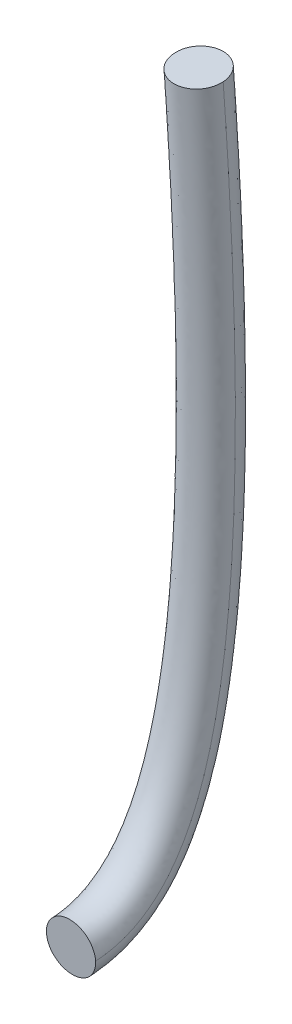
ISO-10303-21;
HEADER;
FILE_DESCRIPTION(('STEP AP214'),'2;1');
FILE_NAME('part.step','',(''),(''),'','','');
FILE_SCHEMA(('AUTOMOTIVE_DESIGN { 1 0 10303 214 1 1 1 1 }'));
ENDSEC;
DATA;
#1=APPLICATION_CONTEXT('core data for automotive mechanical design processes');
#2=APPLICATION_PROTOCOL_DEFINITION('international standard','automotive_design',2000,#1);
#3=PRODUCT_CONTEXT('',#1,'mechanical');
#4=PRODUCT('Part','Part','',(#3));
#5=PRODUCT_RELATED_PRODUCT_CATEGORY('part','',(#4));
#6=PRODUCT_DEFINITION_FORMATION('','',#4);
#7=PRODUCT_DEFINITION_CONTEXT('part definition',#1,'design');
#8=PRODUCT_DEFINITION('design','',#6,#7);
#9=PRODUCT_DEFINITION_SHAPE('','',#8);
#10=(LENGTH_UNIT() NAMED_UNIT(*) SI_UNIT(.MILLI.,.METRE.));
#11=(NAMED_UNIT(*) PLANE_ANGLE_UNIT() SI_UNIT($,.RADIAN.));
#12=(NAMED_UNIT(*) SI_UNIT($,.STERADIAN.) SOLID_ANGLE_UNIT());
#13=UNCERTAINTY_MEASURE_WITH_UNIT(LENGTH_MEASURE(1.E-05),#10,'distance_accuracy_value','');
#14=(GEOMETRIC_REPRESENTATION_CONTEXT(3) GLOBAL_UNCERTAINTY_ASSIGNED_CONTEXT((#13)) GLOBAL_UNIT_ASSIGNED_CONTEXT((#10,
#11,#12)) REPRESENTATION_CONTEXT('',''));
#15=CARTESIAN_POINT('',(0.,0.,0.));
#16=DIRECTION('',(0.,0.,1.));
#17=DIRECTION('',(1.,0.,0.));
#18=AXIS2_PLACEMENT_3D('',#15,#16,#17);
#19=CARTESIAN_POINT('',(25.625,-7.38568943191456,11.1672900449514));
#20=CARTESIAN_POINT('',(25.6249999999998,-7.37642950308164,10.9994364502612));
#21=CARTESIAN_POINT('',(25.6249999999996,-7.27631127881116,10.6948021147548));
#22=CARTESIAN_POINT('',(25.6249999999997,-6.87049792354858,10.3351974211068));
#23=CARTESIAN_POINT('',(25.6250000000001,-6.18722766399162,10.0812489826231));
#24=CARTESIAN_POINT('',(25.6250000000006,-5.06639524678638,9.90823536518859));
#25=CARTESIAN_POINT('',(25.6250000000009,-3.38100140559299,9.86451819427135));
#26=CARTESIAN_POINT('',(25.6250000000004,-1.83527381521949,9.93899557759439));
#27=CARTESIAN_POINT('',(25.625,-1.00000001490137,10.0000001490162));
#28=CARTESIAN_POINT('',(25.625000000001,-7.43610265920569,11.1645089135862));
#29=CARTESIAN_POINT('',(25.6250000000008,-7.42638032085317,10.9882732782254));
#30=CARTESIAN_POINT('',(25.6250000000007,-7.31962391119563,10.663863154122));
#31=CARTESIAN_POINT('',(25.6250000000008,-6.89389460357569,10.2891900921489));
#32=CARTESIAN_POINT('',(25.6250000000012,-6.19822115272071,10.0317030959541));
#33=CARTESIAN_POINT('',(25.6250000000017,-5.06946988828723,9.85763202290294));
#34=CARTESIAN_POINT('',(25.6250000000019,-3.37990497108782,9.81401688870553));
#35=CARTESIAN_POINT('',(25.6250000000015,-1.83238214013707,9.88858240859414));
#36=CARTESIAN_POINT('',(25.625000000001,-0.996322261093759,9.94964439160444));
#37=CARTESIAN_POINT('',(25.6014558196561,-7.50309691686465,11.1608130614999));
#38=CARTESIAN_POINT('',(25.6014558196559,-7.49276045520994,10.9734452883316));
#39=CARTESIAN_POINT('',(25.6014558196557,-7.37717732256412,10.6227575169738));
#40=CARTESIAN_POINT('',(25.6014558196558,-6.92499161090427,10.2280673151373));
#41=CARTESIAN_POINT('',(25.6014558196562,-6.21283702915476,9.96587232267118));
#42=CARTESIAN_POINT('',(25.6014558196567,-5.07356146919937,9.79039233227121));
#43=CARTESIAN_POINT('',(25.601455819657,-3.37845320031232,9.7469097299548));
#44=CARTESIAN_POINT('',(25.6014558196565,-1.82853875078202,9.82158827480915));
#45=CARTESIAN_POINT('',(25.6014558196561,-0.99143488531101,9.88272650580492));
#46=CARTESIAN_POINT('',(25.5294787377127,-7.574708431295,11.1568624905964));
#47=CARTESIAN_POINT('',(25.5294787377125,-7.56371622354454,10.9576080883444));
#48=CARTESIAN_POINT('',(25.5294787377123,-7.43868821079338,10.5788362060441));
#49=CARTESIAN_POINT('',(25.5294787377124,-6.95824142372153,10.1627629093637));
#50=CARTESIAN_POINT('',(25.5294787377128,-6.22847264731504,9.8955249203416));
#51=CARTESIAN_POINT('',(25.5294787377133,-5.07794572483307,9.71853202565486));
#52=CARTESIAN_POINT('',(25.5294787377136,-3.37691130562669,9.67518532771332));
#53=CARTESIAN_POINT('',(25.5294787377131,-1.8244292797513,9.74997698003554));
#54=CARTESIAN_POINT('',(25.5294787377127,-0.986210670674989,9.81119662679685));
#55=CARTESIAN_POINT('',(25.4361632911616,-7.61993766165806,11.1543673432325));
#56=CARTESIAN_POINT('',(25.4361632911614,-7.60853037733703,10.9475888988735));
#57=CARTESIAN_POINT('',(25.4361632911612,-7.47754981155898,10.5510733568784));
#58=CARTESIAN_POINT('',(25.4361632911613,-6.97922926280271,10.1214769710157));
#59=CARTESIAN_POINT('',(25.4361632911617,-6.23833184728273,9.85106753949907));
#60=CARTESIAN_POINT('',(25.4361632911622,-5.0807009069797,9.67312805005117));
#61=CARTESIAN_POINT('',(25.4361632911625,-3.3759245550945,9.62987467288582));
#62=CARTESIAN_POINT('',(25.436163291162,-1.82183532421436,9.70474777506866));
#63=CARTESIAN_POINT('',(25.4361632911616,-0.982911100639132,9.76601895668007));
#64=CARTESIAN_POINT('',(25.2949455160897,-7.60399867079656,11.1552466447533));
#65=CARTESIAN_POINT('',(25.2949455160895,-7.59273786953006,10.9511234807646));
#66=CARTESIAN_POINT('',(25.2949455160894,-7.46385210302982,10.5608622484204));
#67=CARTESIAN_POINT('',(25.2949455160895,-6.97183589259492,10.1360354992856));
#68=CARTESIAN_POINT('',(25.2949455160899,-6.23486109615012,9.86674058148387));
#69=CARTESIAN_POINT('',(25.2949455160904,-5.0797331321152,9.68913263732427));
#70=CARTESIAN_POINT('',(25.2949455160906,-3.37627523259321,9.64584466686064));
#71=CARTESIAN_POINT('',(25.2949455160902,-1.82274909235873,9.72068678282293));
#72=CARTESIAN_POINT('',(25.2949455160897,-0.984073884445762,9.78193977747127));
#73=CARTESIAN_POINT('',(25.1680955457305,-7.47839466474527,11.1621758032222));
#74=CARTESIAN_POINT('',(25.1680955457303,-7.46828503153356,10.9789197214295));
#75=CARTESIAN_POINT('',(25.1680955457301,-7.35595108834263,10.6379236311398));
#76=CARTESIAN_POINT('',(25.1680955457302,-6.91353075570379,10.2506217081272));
#77=CARTESIAN_POINT('',(25.1680955457306,-6.20745468367914,9.99015685038805));
#78=CARTESIAN_POINT('',(25.1680955457311,-5.07205870745476,9.81519256043686));
#79=CARTESIAN_POINT('',(25.1680955457314,-3.37899398021394,9.7716579117466));
#80=CARTESIAN_POINT('',(25.1680955457309,-1.82995523363427,9.84629052939088));
#81=CARTESIAN_POINT('',(25.1680955457305,-0.99323696795245,9.90740059794474));
#82=CARTESIAN_POINT('',(25.1680052570041,-7.34853018912359,11.1693399977358));
#83=CARTESIAN_POINT('',(25.1680052570039,-7.33961103062633,11.0076635051404));
#84=CARTESIAN_POINT('',(25.1680052570037,-7.24438672468251,10.7176053189323));
#85=CARTESIAN_POINT('',(25.1680052570038,-6.85325145601574,10.3691060864338));
#86=CARTESIAN_POINT('',(25.1680052570042,-6.17912322844163,10.1177669209717));
#87=CARTESIAN_POINT('',(25.1680052570047,-5.06412790780888,9.94553341823572));
#88=CARTESIAN_POINT('',(25.168005257005,-3.38180861115756,9.90174159871763));
#89=CARTESIAN_POINT('',(25.1680052570045,-1.83740536552874,9.97615476891002));
#90=CARTESIAN_POINT('',(25.1680052570041,-1.00271086191551,10.0371170311547));
#91=CARTESIAN_POINT('',(25.1971056395939,-7.2881659609287,11.1726700929784));
#92=CARTESIAN_POINT('',(25.1971056395937,-7.27979999106427,11.0210211829097));
#93=CARTESIAN_POINT('',(25.1971056395936,-7.19253109322445,10.7546390623493));
#94=CARTESIAN_POINT('',(25.1971056395937,-6.82522977370396,10.4241729165544));
#95=CARTESIAN_POINT('',(25.197105639594,-6.16595100024323,10.1770781981071));
#96=CARTESIAN_POINT('',(25.1971056395946,-5.06043883752271,10.0061157330043));
#97=CARTESIAN_POINT('',(25.1971056395948,-3.38311446859936,9.96220579694382));
#98=CARTESIAN_POINT('',(25.1971056395944,-1.84086866655294,10.0365188658134));
#99=CARTESIAN_POINT('',(25.1971056395939,-1.00711456273007,10.0974124455659));
#100=B_SPLINE_SURFACE_WITH_KNOTS('',3,3,((#19,#20,#21,#22,#23,#24,#25,#26,#27),(#28,#29,#30,#31,
#32,#33,#34,#35,#36),(#37,#38,#39,#40,#41,#42,#43,#44,#45),(#46,#47,#48,#49,#50,#51,#52,#53,
#54),(#55,#56,#57,#58,#59,#60,#61,#62,#63),(#64,#65,#66,#67,#68,#69,#70,#71,#72),(#73,#74,#75,
#76,#77,#78,#79,#80,#81),(#82,#83,#84,#85,#86,#87,#88,#89,#90),(#91,#92,#93,#94,#95,#96,#97,#98,
#99)),.UNSPECIFIED.,.F.,.F.,.F.,(4,1,1,1,1,1,4),(4,1,1,1,1,1,4),(-3.14159265358979,
-2.46839422782055,-2.24399475256414,-1.79519580205131,-1.12199737628207,-0.448798950512828,
0.448798950512828),(0.,0.142857142857143,0.285714285714286,0.428571428571429,0.571428571428571,
0.785714285714286,1.),.UNSPECIFIED.);
#101=CARTESIAN_POINT('',(25.625,-7.38568943191456,11.1672900449514));
#102=CARTESIAN_POINT('',(25.6249999999998,-7.37642950308164,10.9994364502612));
#103=CARTESIAN_POINT('',(25.6249999999996,-7.27631127881116,10.6948021147548));
#104=CARTESIAN_POINT('',(25.6249999999997,-6.87049792354858,10.3351974211068));
#105=CARTESIAN_POINT('',(25.6250000000001,-6.18722766399162,10.0812489826231));
#106=CARTESIAN_POINT('',(25.6250000000006,-5.06639524678638,9.90823536518859));
#107=CARTESIAN_POINT('',(25.6250000000009,-3.38100140559299,9.86451819427135));
#108=CARTESIAN_POINT('',(25.6250000000004,-1.83527381521949,9.93899557759439));
#109=CARTESIAN_POINT('',(25.625,-1.00000001490137,10.0000001490162));
#110=B_SPLINE_CURVE_WITH_KNOTS('',3,(#101,#102,#103,#104,#105,#106,#107,#108,#109),
.UNSPECIFIED.,.F.,.F.,(4,1,1,1,1,1,4),(0.,0.142857142857143,0.285714285714286,0.428571428571429,
0.571428571428571,0.785714285714286,1.),.UNSPECIFIED.);
#111=CARTESIAN_POINT('',(25.625,-7.38568943191456,11.1672900449514));
#112=VERTEX_POINT('',#111);
#113=CARTESIAN_POINT('',(25.625,-1.00000001490137,10.0000001490162));
#114=VERTEX_POINT('',#113);
#115=EDGE_CURVE('E11',#112,#114,#110,.T.);
#116=CARTESIAN_POINT('',(25.625,-7.38568943191456,11.1672900449514));
#117=CARTESIAN_POINT('',(25.6250211075112,-7.41102308642647,11.1658924708435));
#118=CARTESIAN_POINT('',(25.6205250553208,-7.43642925801617,11.1644908962077));
#119=CARTESIAN_POINT('',(25.6035792901555,-7.4843690622815,11.1618462154276));
#120=CARTESIAN_POINT('',(25.5911349067094,-7.50690460763905,11.1606030037668));
#121=CARTESIAN_POINT('',(25.5593185159836,-7.54639429217405,11.1584244882033));
#122=CARTESIAN_POINT('',(25.5399554040417,-7.56335554465358,11.1574887918831));
#123=CARTESIAN_POINT('',(25.496906125846,-7.58996473926369,11.1560208504379));
#124=CARTESIAN_POINT('',(25.47325036948,-7.59966180945149,11.15548589508));
#125=CARTESIAN_POINT('',(25.4239882329234,-7.6105223303087,11.1548867559886));
#126=CARTESIAN_POINT('',(25.3983770303981,-7.61166394750519,11.1548237767357));
#127=CARTESIAN_POINT('',(25.3481088455901,-7.60564185965694,11.155155995447));
#128=CARTESIAN_POINT('',(25.3234536268244,-7.59846349587244,11.1555520020854));
#129=CARTESIAN_POINT('',(25.2779899711323,-7.57620562178092,11.156779895539));
#130=CARTESIAN_POINT('',(25.2571868983431,-7.56111520419915,11.1576123840724));
#131=CARTESIAN_POINT('',(25.2214901167556,-7.52495385780961,11.1596072862054));
#132=CARTESIAN_POINT('',(25.2066194159388,-7.50386017739848,11.1607709549358));
#133=CARTESIAN_POINT('',(25.1854429374258,-7.45823175818084,11.1632881242314));
#134=CARTESIAN_POINT('',(25.1789687492256,-7.43377592756988,11.1646372716919));
#135=CARTESIAN_POINT('',(25.1752061966162,-7.39653067729301,11.166691969225));
#136=CARTESIAN_POINT('',(25.1749619305825,-7.38393739787221,11.1673866988876));
#137=CARTESIAN_POINT('',(25.1764970390348,-7.35886289771815,11.1687699763049));
#138=CARTESIAN_POINT('',(25.1782753937152,-7.34638162370853,11.1694585269986));
#139=CARTESIAN_POINT('',(25.1839935858218,-7.32136239604559,11.170838755215));
#140=CARTESIAN_POINT('',(25.1880212318897,-7.30884415943324,11.1715293450135));
#141=CARTESIAN_POINT('',(25.198333040277,-7.28477482218534,11.1728571709107));
#142=CARTESIAN_POINT('',(25.2046157759572,-7.27322311577756,11.1734944404279));
#143=CARTESIAN_POINT('',(25.2186110508622,-7.25221226127907,11.174653539926));
#144=CARTESIAN_POINT('',(25.2261888794424,-7.24266248250153,11.175180369703));
#145=CARTESIAN_POINT('',(25.2427546317192,-7.2248520161327,11.1761629143506));
#146=CARTESIAN_POINT('',(25.2517444507677,-7.21659309145561,11.1766185319672));
#147=CARTESIAN_POINT('',(25.2714964382354,-7.20109163135829,11.1774736963595));
#148=CARTESIAN_POINT('',(25.2823343041849,-7.1939450150621,11.1778679515938));
#149=CARTESIAN_POINT('',(25.3050441845537,-7.18156959180672,11.1785506628507));
#150=CARTESIAN_POINT('',(25.3169146958787,-7.17633805325396,11.1788392695664));
#151=CARTESIAN_POINT('',(25.3413510345715,-7.16810727735885,11.1792933343076));
#152=CARTESIAN_POINT('',(25.3539131404845,-7.16509714840873,11.1794593931871));
#153=CARTESIAN_POINT('',(25.379377359816,-7.16139049551298,11.1796638769938));
#154=CARTESIAN_POINT('',(25.3922796821729,-7.16069542832885,11.1797022215564));
#155=CARTESIAN_POINT('',(25.4172948477089,-7.16144929867084,11.1796606330177));
#156=CARTESIAN_POINT('',(25.4294117832015,-7.16278144476146,11.1795871429144));
#157=CARTESIAN_POINT('',(25.4532986343474,-7.16730241858897,11.1793377357094));
#158=CARTESIAN_POINT('',(25.4650683689974,-7.17049219738625,11.1791617661408));
#159=CARTESIAN_POINT('',(25.4888756507422,-7.17898809697809,11.1786930754002));
#160=CARTESIAN_POINT('',(25.500861299844,-7.18444109552565,11.1783922514675));
#161=CARTESIAN_POINT('',(25.5236656031083,-7.19736394294409,11.1776793406261));
#162=CARTESIAN_POINT('',(25.5344858902735,-7.20483091682431,11.1772674123212));
#163=CARTESIAN_POINT('',(25.5635376447332,-7.22919326954093,11.1759234217276));
#164=CARTESIAN_POINT('',(25.5797529228129,-7.248551797651,11.1748554756229));
#165=CARTESIAN_POINT('',(25.6053534501322,-7.29144760632408,11.1724890554322));
#166=CARTESIAN_POINT('',(25.6146951433863,-7.31501037935548,11.1711891750109));
#167=CARTESIAN_POINT('',(25.6232711531925,-7.35460726321688,11.1690047456144));
#168=CARTESIAN_POINT('',(25.6249870400801,-7.37013467843561,11.1681481493637));
#169=CARTESIAN_POINT('',(25.625,-7.38568943191456,11.1672900449514));
#170=B_SPLINE_CURVE_WITH_KNOTS('',3,(#116,#117,#118,#119,#120,#121,#122,#123,#124,#125,#126,
#127,#128,#129,#130,#131,#132,#133,#134,#135,#136,#137,#138,#139,#140,#141,#142,#143,#144,#145,
#146,#147,#148,#149,#150,#151,#152,#153,#154,#155,#156,#157,#158,#159,#160,#161,#162,#163,#164,
#165,#166,#167,#168,#169),.UNSPECIFIED.,.T.,.F.,(4,2,2,2,2,2,2,2,2,2,2,2,2,2,2,2,2,2,2,2,2,2,2,
2,2,2,4),(0.,0.0759437524186467,0.151836636283657,0.227632294484874,0.302910596160767,
0.378380942474387,0.453984460249263,0.529692477437848,0.605691329048027,0.680141000987847,
0.717864773102519,0.755569533313336,0.794860955325162,0.834127564059205,0.870580528183726,
0.907082848983204,0.945868940457325,0.984599491360131,1.0231388606141,1.06170247633695,
1.09812692797673,1.13457004441805,1.17388299832288,1.21314012652226,1.28747279510186,
1.36227252541108,1.40890165847134),.UNSPECIFIED.);
#171=CARTESIAN_POINT('',(25.1971056395939,-7.2881659609287,11.1726700929784));
#172=VERTEX_POINT('',#171);
#173=EDGE_CURVE('E46',#112,#172,#170,.T.);
#174=CARTESIAN_POINT('',(25.1971056395939,-7.2881659609287,11.1726700929784));
#175=CARTESIAN_POINT('',(25.1971056395937,-7.27979999106427,11.0210211829097));
#176=CARTESIAN_POINT('',(25.1971056395936,-7.19253109322445,10.7546390623493));
#177=CARTESIAN_POINT('',(25.1971056395937,-6.82522977370396,10.4241729165544));
#178=CARTESIAN_POINT('',(25.197105639594,-6.16595100024323,10.1770781981071));
#179=CARTESIAN_POINT('',(25.1971056395946,-5.06043883752271,10.0061157330043));
#180=CARTESIAN_POINT('',(25.1971056395948,-3.38311446859936,9.96220579694382));
#181=CARTESIAN_POINT('',(25.1971056395944,-1.84086866655294,10.0365188658134));
#182=CARTESIAN_POINT('',(25.1971056395939,-1.00711456273007,10.0974124455659));
#183=B_SPLINE_CURVE_WITH_KNOTS('',3,(#174,#175,#176,#177,#178,#179,#180,#181,#182),
.UNSPECIFIED.,.F.,.F.,(4,1,1,1,1,1,4),(0.,0.142857142857143,0.285714285714286,0.428571428571429,
0.571428571428571,0.785714285714286,1.),.UNSPECIFIED.);
#184=CARTESIAN_POINT('',(25.1971056395939,-1.00711456273007,10.0974124455659));
#185=VERTEX_POINT('',#184);
#186=EDGE_CURVE('E28',#172,#185,#183,.T.);
#187=CARTESIAN_POINT('',(25.625,-1.00000001490137,10.0000001490162));
#188=CARTESIAN_POINT('',(25.624989117873,-1.0009257829927,10.0126757537101));
#189=CARTESIAN_POINT('',(25.6238469355834,-1.00185183190408,10.0253552033882));
#190=CARTESIAN_POINT('',(25.6194159937356,-1.00367782306447,10.0503566506624));
#191=CARTESIAN_POINT('',(25.6161221333936,-1.00457769795693,10.0626777260132));
#192=CARTESIAN_POINT('',(25.6075783537225,-1.0063236539033,10.0865833321755));
#193=CARTESIAN_POINT('',(25.6023341441581,-1.0071698836248,10.0981698985417));
#194=CARTESIAN_POINT('',(25.5900333016381,-1.00878853325052,10.1203324282135));
#195=CARTESIAN_POINT('',(25.5829779545045,-1.00956100498779,10.1309091012167));
#196=CARTESIAN_POINT('',(25.5669536655287,-1.01103171336798,10.1510460212743));
#197=CARTESIAN_POINT('',(25.5579336490335,-1.0117270263882,10.1605662381249));
#198=CARTESIAN_POINT('',(25.5382855501423,-1.01298377030348,10.1777735595054));
#199=CARTESIAN_POINT('',(25.527658547393,-1.01354529043917,10.1854618859169));
#200=CARTESIAN_POINT('',(25.5059967124439,-1.01448729305873,10.1983597735604));
#201=CARTESIAN_POINT('',(25.4950418462813,-1.01487766123809,10.2037046896069));
#202=CARTESIAN_POINT('',(25.472416209708,-1.01552916659407,10.2126250924869));
#203=CARTESIAN_POINT('',(25.4607444804749,-1.01579012625849,10.2161981488258));
#204=CARTESIAN_POINT('',(25.4362572529334,-1.01618915161717,10.221661598859));
#205=CARTESIAN_POINT('',(25.4234154845841,-1.01631871181112,10.2234355353532));
#206=CARTESIAN_POINT('',(25.3976277160055,-1.01641958339288,10.2248166677417));
#207=CARTESIAN_POINT('',(25.3846818887249,-1.01639111816075,10.2244269221526));
#208=CARTESIAN_POINT('',(25.3591082637018,-1.01616604908389,10.2213452792725));
#209=CARTESIAN_POINT('',(25.3464794794032,-1.01597005798373,10.2186617716722));
#210=CARTESIAN_POINT('',(25.3219138301033,-1.01541510452411,10.2110633561039));
#211=CARTESIAN_POINT('',(25.3099773833377,-1.01505604478901,10.20614711487));
#212=CARTESIAN_POINT('',(25.2877365526709,-1.01422158840844,10.1947217489348));
#213=CARTESIAN_POINT('',(25.2773784750799,-1.01375369508946,10.1883153596826));
#214=CARTESIAN_POINT('',(25.2577740773318,-1.01270674347094,10.1739805117069));
#215=CARTESIAN_POINT('',(25.2485283943649,-1.01212762194727,10.1660511873193));
#216=CARTESIAN_POINT('',(25.2306931335912,-1.01082083595155,10.1481586904225));
#217=CARTESIAN_POINT('',(25.2222155363248,-1.01008498607178,10.138083443417));
#218=CARTESIAN_POINT('',(25.2071827560151,-1.00851762832831,10.1166232015311));
#219=CARTESIAN_POINT('',(25.2006247562134,-1.00768626314259,10.1052401601958));
#220=CARTESIAN_POINT('',(25.1848745214626,-1.00516564048379,10.0707278274588));
#221=CARTESIAN_POINT('',(25.1785767509009,-1.00337444331952,10.0462027791279));
#222=CARTESIAN_POINT('',(25.1751252091411,-1.0006579421342,10.0090084801475));
#223=CARTESIAN_POINT('',(25.1749859182296,-0.999743644920795,9.99648993456543));
#224=CARTESIAN_POINT('',(25.1767062659292,-0.997924134636987,9.97157722336931));
#225=CARTESIAN_POINT('',(25.1785645954626,-0.997018916009359,9.95918298166585));
#226=CARTESIAN_POINT('',(25.1844320055603,-0.99519994172185,9.93427760932414));
#227=CARTESIAN_POINT('',(25.1885399647495,-0.994287858896628,9.92178938311632));
#228=CARTESIAN_POINT('',(25.1989925393623,-0.99253418942091,9.89777816341029));
#229=CARTESIAN_POINT('',(25.2053368477433,-0.991692593112491,9.88625503767594));
#230=CARTESIAN_POINT('',(25.2194870291277,-0.990157172700185,9.86523208131419));
#231=CARTESIAN_POINT('',(25.2271702513975,-0.989457285108517,9.8556492294908));
#232=CARTESIAN_POINT('',(25.2439721800538,-0.988155549759407,9.83782588598207));
#233=CARTESIAN_POINT('',(25.2530914381525,-0.987553739864109,9.82958591270474));
#234=CARTESIAN_POINT('',(25.2729586917665,-0.98643997490819,9.81433625738053));
#235=CARTESIAN_POINT('',(25.2837601999796,-0.985933053459689,9.80739549548549));
#236=CARTESIAN_POINT('',(25.3064078830041,-0.985064140286681,9.79549834759577));
#237=CARTESIAN_POINT('',(25.3182536755452,-0.984702095795207,9.79054123911643));
#238=CARTESIAN_POINT('',(25.3423644614559,-0.984135796973625,9.78278748299975));
#239=CARTESIAN_POINT('',(25.3546160312752,-0.983928483575859,9.77994895064771));
#240=CARTESIAN_POINT('',(25.3794214073466,-0.983661575784799,9.77629445263605));
#241=CARTESIAN_POINT('',(25.3919753124639,-0.983602030393196,9.77547915790697));
#242=CARTESIAN_POINT('',(25.4173768167053,-0.983634254406939,9.77592036868518));
#243=CARTESIAN_POINT('',(25.4302236367778,-0.983729967359263,9.77723086918654));
#244=CARTESIAN_POINT('',(25.4554823344256,-0.984084807541294,9.78208933635473));
#245=CARTESIAN_POINT('',(25.4678943340663,-0.984343888514972,9.7856366696846));
#246=CARTESIAN_POINT('',(25.4915609879704,-0.985002425095227,9.79465334399652));
#247=CARTESIAN_POINT('',(25.5028392305269,-0.98539742161054,9.80006163115885));
#248=CARTESIAN_POINT('',(25.5243663384569,-0.986315630053261,9.81263372924217));
#249=CARTESIAN_POINT('',(25.534615014871,-0.986838865456351,9.81979786159191));
#250=CARTESIAN_POINT('',(25.5540361715917,-0.988016631482464,9.83592381873903));
#251=CARTESIAN_POINT('',(25.5631746845518,-0.988674160740239,9.84492670080452));
#252=CARTESIAN_POINT('',(25.5797308484375,-0.990094107454939,9.86436859279724));
#253=CARTESIAN_POINT('',(25.5871485776053,-0.990856520140415,9.87480753739384));
#254=CARTESIAN_POINT('',(25.6062462420562,-0.993226086008498,9.90725160251253));
#255=CARTESIAN_POINT('',(25.6153326302857,-0.994950841679487,9.93086693477951));
#256=CARTESIAN_POINT('',(25.6234371200941,-0.997806289741154,9.96996369258803));
#257=CARTESIAN_POINT('',(25.6250128956093,-0.998902955145167,9.98497922106966));
#258=CARTESIAN_POINT('',(25.625,-1.00000001490137,10.0000001490162));
#259=B_SPLINE_CURVE_WITH_KNOTS('',3,(#187,#188,#189,#190,#191,#192,#193,#194,#195,#196,#197,
#198,#199,#200,#201,#202,#203,#204,#205,#206,#207,#208,#209,#210,#211,#212,#213,#214,#215,#216,
#217,#218,#219,#220,#221,#222,#223,#224,#225,#226,#227,#228,#229,#230,#231,#232,#233,#234,#235,
#236,#237,#238,#239,#240,#241,#242,#243,#244,#245,#246,#247,#248,#249,#250,#251,#252,#253,#254,
#255,#256,#257,#258),.UNSPECIFIED.,.T.,.F.,(4,2,2,2,2,2,2,2,2,2,2,2,2,2,2,2,2,2,2,2,2,2,2,2,2,2,
2,2,2,2,2,2,2,2,2,4),(0.,0.0380907214368378,0.0762720703207929,0.114342509805263,
0.152385995473015,0.191571210115582,0.230730214361601,0.267161631709072,0.303642885457673,
0.342358436528764,0.381019274395289,0.419539308073488,0.458082374108739,0.49450096228036,
0.530940313034225,0.570300264735894,0.609602167944814,0.684074884302786,0.721623310520954,
0.759147145549961,0.798470681985579,0.837788821543274,0.874536776852155,0.911298884995226,
0.949656563645385,0.988000258949044,1.02556420450721,1.06314060506888,1.10168647419082,
1.14022143433132,1.17759671827205,1.21497884932844,1.25331095302773,1.29164131346492,
1.36618252562095,1.41132104137253),.UNSPECIFIED.);
#260=EDGE_CURVE('E47',#185,#114,#259,.T.);
#261=ORIENTED_EDGE('',*,*,#115,.F.);
#262=ORIENTED_EDGE('',*,*,#173,.T.);
#263=ORIENTED_EDGE('',*,*,#186,.T.);
#264=ORIENTED_EDGE('',*,*,#260,.T.);
#265=EDGE_LOOP('',(#261,#262,#263,#264));
#266=FACE_BOUND('',#265,.T.);
#267=ADVANCED_FACE('F16',(#266),#100,.T.);
#268=CARTESIAN_POINT('',(25.4,-7.38568943191911,11.1672900449514));
#269=DIRECTION('',(-1.11249196396045E-12,0.0550829445172842,-0.998481782118886));
#270=DIRECTION('',(0.,0.998481782118886,0.0550829445172842));
#271=AXIS2_PLACEMENT_3D('',#268,#269,#270);
#272=PLANE('',#271);
#273=ORIENTED_EDGE('',*,*,#173,.F.);
#274=EDGE_CURVE('E49',#172,#112,#170,.T.);
#275=ORIENTED_EDGE('',*,*,#274,.F.);
#276=EDGE_LOOP('',(#273,#275));
#277=FACE_BOUND('',#276,.T.);
#278=ADVANCED_FACE('F53',(#277),#272,.F.);
#279=CARTESIAN_POINT('',(25.4,-1.00000001490116,10.0000001490116));
#280=DIRECTION('',(-5.32623886368089E-13,0.997343536648528,0.0728414024124084));
#281=DIRECTION('',(0.,-0.0728414024124084,0.997343536648528));
#282=AXIS2_PLACEMENT_3D('',#279,#280,#281);
#283=PLANE('',#282);
#284=EDGE_CURVE('E55',#114,#185,#259,.T.);
#285=ORIENTED_EDGE('',*,*,#284,.F.);
#286=ORIENTED_EDGE('',*,*,#260,.F.);
#287=EDGE_LOOP('',(#285,#286));
#288=FACE_BOUND('',#287,.T.);
#289=ADVANCED_FACE('F83',(#288),#283,.T.);
#290=CARTESIAN_POINT('',(25.1971056395939,-7.2881659609287,11.1726700929784));
#291=CARTESIAN_POINT('',(25.1971056395937,-7.27979999106427,11.0210211829097));
#292=CARTESIAN_POINT('',(25.1971056395936,-7.19253109322445,10.7546390623493));
#293=CARTESIAN_POINT('',(25.1971056395937,-6.82522977370396,10.4241729165544));
#294=CARTESIAN_POINT('',(25.197105639594,-6.16595100024323,10.1770781981071));
#295=CARTESIAN_POINT('',(25.1971056395946,-5.06043883752271,10.0061157330043));
#296=CARTESIAN_POINT('',(25.1971056395948,-3.38311446859936,9.96220579694382));
#297=CARTESIAN_POINT('',(25.1971056395944,-1.84086866655294,10.0365188658134));
#298=CARTESIAN_POINT('',(25.1971056395939,-1.00711456273007,10.0974124455659));
#299=CARTESIAN_POINT('',(25.2262060221837,-7.22780173273381,11.176000188221));
#300=CARTESIAN_POINT('',(25.2262060221835,-7.21998895150221,11.034378860679));
#301=CARTESIAN_POINT('',(25.2262060221834,-7.14067546176639,10.7916728057663));
#302=CARTESIAN_POINT('',(25.2262060221835,-6.79720809139217,10.4792397466751));
#303=CARTESIAN_POINT('',(25.2262060221838,-6.15277877204483,10.2363894752425));
#304=CARTESIAN_POINT('',(25.2262060221844,-5.05674976723654,10.0666980477729));
#305=CARTESIAN_POINT('',(25.2262060221846,-3.38442032604115,10.02266999517));
#306=CARTESIAN_POINT('',(25.2262060221842,-1.84433196757715,10.0968829627167));
#307=CARTESIAN_POINT('',(25.2262060221837,-1.01151826354463,10.1577078599772));
#308=CARTESIAN_POINT('',(25.342710739659,-7.13476136352188,11.1811329183187));
#309=CARTESIAN_POINT('',(25.3427107396588,-7.1278007942908,11.0549595332296));
#310=CARTESIAN_POINT('',(25.3427107396586,-7.06075506583143,10.8487429933857));
#311=CARTESIAN_POINT('',(25.3427107396587,-6.75401199035992,10.564096349093));
#312=CARTESIAN_POINT('',(25.3427107396591,-6.13246866523697,10.3277945031172));
#313=CARTESIAN_POINT('',(25.3427107396596,-5.05105725711575,10.1600663265058));
#314=CARTESIAN_POINT('',(25.3427107396599,-3.38642703472991,10.1158597172507));
#315=CARTESIAN_POINT('',(25.3427107396594,-1.84967073522314,10.1899230765939));
#316=CARTESIAN_POINT('',(25.342710739659,-1.01830575941653,10.2506421653823));
#317=CARTESIAN_POINT('',(25.5605991532795,-7.18477513611118,11.1783738235508));
#318=CARTESIAN_POINT('',(25.5605991532793,-7.17735722594958,11.0439102754847));
#319=CARTESIAN_POINT('',(25.5605991532791,-7.10370628569658,10.8180838310313));
#320=CARTESIAN_POINT('',(25.5605991532792,-6.7772424616943,10.5185154595848));
#321=CARTESIAN_POINT('',(25.5605991532796,-6.14339985798039,10.2786820568526));
#322=CARTESIAN_POINT('',(25.5605991532801,-5.05412888917914,10.1098910427703));
#323=CARTESIAN_POINT('',(25.5605991532804,-3.38535914198285,10.0657741447252));
#324=CARTESIAN_POINT('',(25.5605991532799,-1.8467995848137,10.1399095362297));
#325=CARTESIAN_POINT('',(25.5605991532795,-1.014657146692,10.2006854073035));
#326=CARTESIAN_POINT('',(25.6249999999986,-7.31847179552639,11.1709982201049));
#327=CARTESIAN_POINT('',(25.6249999999985,-7.30982729388697,11.0143003987002));
#328=CARTESIAN_POINT('',(25.6249999999983,-7.2185756151628,10.7360264625285));
#329=CARTESIAN_POINT('',(25.6249999999984,-6.83928707480134,10.3964912249925));
#330=CARTESIAN_POINT('',(25.6249999999988,-6.17254991547025,10.1472776201706));
#331=CARTESIAN_POINT('',(25.6249999999993,-5.06227871666609,9.97568490435675));
#332=CARTESIAN_POINT('',(25.6249999999995,-3.38244750396751,9.93184085810146));
#333=CARTESIAN_POINT('',(25.6249999999991,-1.83913128396928,10.00621299735));
#334=CARTESIAN_POINT('',(25.6249999999986,-1.00490368664486,10.0671411588984));
#335=CARTESIAN_POINT('',(25.625,-7.38568943191456,11.1672900449514));
#336=CARTESIAN_POINT('',(25.6249999999998,-7.37642950308164,10.9994364502612));
#337=CARTESIAN_POINT('',(25.6249999999996,-7.27631127881116,10.6948021147548));
#338=CARTESIAN_POINT('',(25.6249999999997,-6.87049792354858,10.3351974211068));
#339=CARTESIAN_POINT('',(25.6250000000001,-6.18722766399162,10.0812489826231));
#340=CARTESIAN_POINT('',(25.6250000000006,-5.06639524678638,9.90823536518859));
#341=CARTESIAN_POINT('',(25.6250000000009,-3.38100140559299,9.86451819427135));
#342=CARTESIAN_POINT('',(25.6250000000004,-1.83527381521949,9.93899557759439));
#343=CARTESIAN_POINT('',(25.625,-1.00000001490137,10.0000001490162));
#344=B_SPLINE_SURFACE_WITH_KNOTS('',3,3,((#290,#291,#292,#293,#294,#295,#296,#297,#298),(#299,
#300,#301,#302,#303,#304,#305,#306,#307),(#308,#309,#310,#311,#312,#313,#314,#315,#316),(#317,
#318,#319,#320,#321,#322,#323,#324,#325),(#326,#327,#328,#329,#330,#331,#332,#333,#334),(#335,
#336,#337,#338,#339,#340,#341,#342,#343)),.UNSPECIFIED.,.F.,.F.,.F.,(4,1,1,4),(4,1,1,1,1,1,4),
(0.448798950512828,1.34639685153848,2.24399475256414,3.14159265358979),(0.,0.142857142857143,
0.285714285714286,0.428571428571429,0.571428571428571,0.785714285714286,1.),.UNSPECIFIED.);
#345=ORIENTED_EDGE('',*,*,#274,.T.);
#346=ORIENTED_EDGE('',*,*,#115,.T.);
#347=ORIENTED_EDGE('',*,*,#284,.T.);
#348=ORIENTED_EDGE('',*,*,#186,.F.);
#349=EDGE_LOOP('',(#345,#346,#347,#348));
#350=FACE_BOUND('',#349,.T.);
#351=ADVANCED_FACE('F50',(#350),#344,.T.);
#352=CLOSED_SHELL('',(#267,#278,#289,#351));
#353=MANIFOLD_SOLID_BREP('B1',#352);
#354=ADVANCED_BREP_SHAPE_REPRESENTATION('',(#18,#353),#14);
#355=SHAPE_DEFINITION_REPRESENTATION(#9,#354);
ENDSEC;
END-ISO-10303-21;
